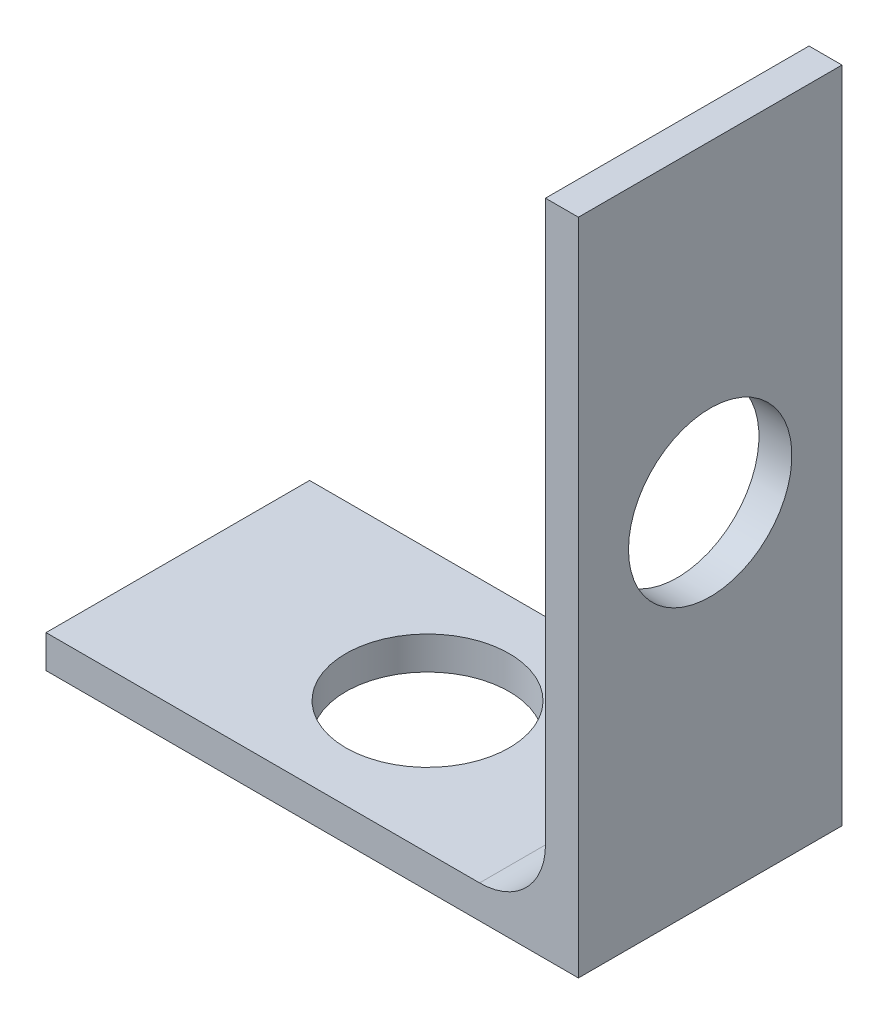
ISO-10303-21;
HEADER;
FILE_DESCRIPTION(('STEP AP214'),'2;1');
FILE_NAME('part.step','',(''),(''),'','','');
FILE_SCHEMA(('AUTOMOTIVE_DESIGN { 1 0 10303 214 1 1 1 1 }'));
ENDSEC;
DATA;
#1=APPLICATION_CONTEXT('core data for automotive mechanical design processes');
#2=APPLICATION_PROTOCOL_DEFINITION('international standard','automotive_design',2000,#1);
#3=PRODUCT_CONTEXT('',#1,'mechanical');
#4=PRODUCT('Part','Part','',(#3));
#5=PRODUCT_RELATED_PRODUCT_CATEGORY('part','',(#4));
#6=PRODUCT_DEFINITION_FORMATION('','',#4);
#7=PRODUCT_DEFINITION_CONTEXT('part definition',#1,'design');
#8=PRODUCT_DEFINITION('design','',#6,#7);
#9=PRODUCT_DEFINITION_SHAPE('','',#8);
#10=(LENGTH_UNIT() NAMED_UNIT(*) SI_UNIT(.MILLI.,.METRE.));
#11=(NAMED_UNIT(*) PLANE_ANGLE_UNIT() SI_UNIT($,.RADIAN.));
#12=(NAMED_UNIT(*) SI_UNIT($,.STERADIAN.) SOLID_ANGLE_UNIT());
#13=UNCERTAINTY_MEASURE_WITH_UNIT(LENGTH_MEASURE(1.E-05),#10,'distance_accuracy_value','');
#14=(GEOMETRIC_REPRESENTATION_CONTEXT(3) GLOBAL_UNCERTAINTY_ASSIGNED_CONTEXT((#13)) GLOBAL_UNIT_ASSIGNED_CONTEXT((#10,
#11,#12)) REPRESENTATION_CONTEXT('',''));
#15=CARTESIAN_POINT('',(0.,0.,0.));
#16=DIRECTION('',(0.,0.,1.));
#17=DIRECTION('',(1.,0.,0.));
#18=AXIS2_PLACEMENT_3D('',#15,#16,#17);
#19=CARTESIAN_POINT('',(20.8915,4.7625,12.7));
#20=DIRECTION('',(0.,0.,-1.));
#21=DIRECTION('',(-1.,0.,0.));
#22=AXIS2_PLACEMENT_3D('',#19,#20,#21);
#23=CYLINDRICAL_SURFACE('',#22,3.175);
#24=DIRECTION('',(0.,0.,1.));
#25=VECTOR('',#24,1.);
#26=CARTESIAN_POINT('',(24.0665,4.7625,12.7));
#27=LINE('',#26,#25);
#28=CARTESIAN_POINT('',(24.0665,4.7625,0.));
#29=VERTEX_POINT('',#28);
#30=CARTESIAN_POINT('',(24.0665,4.7625,12.7));
#31=VERTEX_POINT('',#30);
#32=EDGE_CURVE('E130',#29,#31,#27,.T.);
#33=ORIENTED_EDGE('',*,*,#32,.F.);
#34=CARTESIAN_POINT('',(20.8915,4.7625,0.));
#35=DIRECTION('',(0.,0.,-1.));
#36=DIRECTION('',(-1.,0.,0.));
#37=AXIS2_PLACEMENT_3D('',#34,#35,#36);
#38=CIRCLE('',#37,3.175);
#39=CARTESIAN_POINT('',(20.8915,1.5875,0.));
#40=VERTEX_POINT('',#39);
#41=EDGE_CURVE('E55',#29,#40,#38,.T.);
#42=ORIENTED_EDGE('',*,*,#41,.T.);
#43=DIRECTION('',(0.,0.,1.));
#44=VECTOR('',#43,1.);
#45=CARTESIAN_POINT('',(20.8915,1.5875,12.7));
#46=LINE('',#45,#44);
#47=CARTESIAN_POINT('',(20.8915,1.5875,12.7));
#48=VERTEX_POINT('',#47);
#49=EDGE_CURVE('E136',#48,#40,#46,.F.);
#50=ORIENTED_EDGE('',*,*,#49,.F.);
#51=CARTESIAN_POINT('',(20.8915,4.7625,12.7));
#52=DIRECTION('',(0.,0.,-1.));
#53=DIRECTION('',(-1.,0.,0.));
#54=AXIS2_PLACEMENT_3D('',#51,#52,#53);
#55=CIRCLE('',#54,3.175);
#56=EDGE_CURVE('E11',#48,#31,#55,.F.);
#57=ORIENTED_EDGE('',*,*,#56,.T.);
#58=EDGE_LOOP('',(#33,#42,#50,#57));
#59=FACE_BOUND('',#58,.T.);
#60=ADVANCED_FACE('F47',(#59),#23,.F.);
#61=CARTESIAN_POINT('',(0.,0.,12.7));
#62=DIRECTION('',(1.,0.,0.));
#63=DIRECTION('',(0.,0.,-1.));
#64=AXIS2_PLACEMENT_3D('',#61,#62,#63);
#65=PLANE('',#64);
#66=DIRECTION('',(0.,-1.,0.));
#67=VECTOR('',#66,1.);
#68=CARTESIAN_POINT('',(0.,0.,0.));
#69=LINE('',#68,#67);
#70=CARTESIAN_POINT('',(0.,1.5875,0.));
#71=VERTEX_POINT('',#70);
#72=CARTESIAN_POINT('',(0.,0.,0.));
#73=VERTEX_POINT('',#72);
#74=EDGE_CURVE('E128',#71,#73,#69,.T.);
#75=ORIENTED_EDGE('',*,*,#74,.T.);
#76=DIRECTION('',(0.,0.,-1.));
#77=VECTOR('',#76,1.);
#78=CARTESIAN_POINT('',(0.,0.,12.7));
#79=LINE('',#78,#77);
#80=CARTESIAN_POINT('',(0.,0.,12.7));
#81=VERTEX_POINT('',#80);
#82=EDGE_CURVE('E107',#81,#73,#79,.T.);
#83=ORIENTED_EDGE('',*,*,#82,.F.);
#84=DIRECTION('',(0.,-1.,0.));
#85=VECTOR('',#84,1.);
#86=CARTESIAN_POINT('',(0.,0.,12.7));
#87=LINE('',#86,#85);
#88=CARTESIAN_POINT('',(0.,1.5875,12.7));
#89=VERTEX_POINT('',#88);
#90=EDGE_CURVE('E114',#89,#81,#87,.T.);
#91=ORIENTED_EDGE('',*,*,#90,.F.);
#92=DIRECTION('',(0.,0.,-1.));
#93=VECTOR('',#92,1.);
#94=CARTESIAN_POINT('',(0.,1.5875,12.7));
#95=LINE('',#94,#93);
#96=EDGE_CURVE('E164',#89,#71,#95,.T.);
#97=ORIENTED_EDGE('',*,*,#96,.T.);
#98=EDGE_LOOP('',(#75,#83,#91,#97));
#99=FACE_BOUND('',#98,.T.);
#100=ADVANCED_FACE('F126',(#99),#65,.F.);
#101=CARTESIAN_POINT('',(0.,0.,12.7));
#102=DIRECTION('',(0.,1.,0.));
#103=DIRECTION('',(0.,0.,1.));
#104=AXIS2_PLACEMENT_3D('',#101,#102,#103);
#105=PLANE('',#104);
#106=CARTESIAN_POINT('',(12.03325,0.,6.35));
#107=DIRECTION('',(0.,1.,0.));
#108=DIRECTION('',(0.,0.,1.));
#109=AXIS2_PLACEMENT_3D('',#106,#107,#108);
#110=CIRCLE('',#109,3.937);
#111=CARTESIAN_POINT('',(12.03325,0.,10.287));
#112=VERTEX_POINT('',#111);
#113=EDGE_CURVE('E232',#112,#112,#110,.T.);
#114=ORIENTED_EDGE('',*,*,#113,.T.);
#115=EDGE_LOOP('',(#114));
#116=FACE_BOUND('',#115,.T.);
#117=DIRECTION('',(1.,0.,0.));
#118=VECTOR('',#117,1.);
#119=CARTESIAN_POINT('',(0.,0.,0.));
#120=LINE('',#119,#118);
#121=CARTESIAN_POINT('',(25.654,0.,0.));
#122=VERTEX_POINT('',#121);
#123=EDGE_CURVE('E211',#73,#122,#120,.T.);
#124=ORIENTED_EDGE('',*,*,#123,.T.);
#125=DIRECTION('',(0.,0.,-1.));
#126=VECTOR('',#125,1.);
#127=CARTESIAN_POINT('',(25.654,0.,12.7));
#128=LINE('',#127,#126);
#129=CARTESIAN_POINT('',(25.654,0.,12.7));
#130=VERTEX_POINT('',#129);
#131=EDGE_CURVE('E110',#130,#122,#128,.T.);
#132=ORIENTED_EDGE('',*,*,#131,.F.);
#133=DIRECTION('',(1.,0.,0.));
#134=VECTOR('',#133,1.);
#135=CARTESIAN_POINT('',(0.,0.,12.7));
#136=LINE('',#135,#134);
#137=EDGE_CURVE('E103',#81,#130,#136,.T.);
#138=ORIENTED_EDGE('',*,*,#137,.F.);
#139=ORIENTED_EDGE('',*,*,#82,.T.);
#140=EDGE_LOOP('',(#124,#132,#138,#139));
#141=FACE_BOUND('',#140,.T.);
#142=ADVANCED_FACE('F105',(#116,#141),#105,.F.);
#143=CARTESIAN_POINT('',(25.654,0.,12.7));
#144=DIRECTION('',(-1.,0.,0.));
#145=DIRECTION('',(0.,0.,1.));
#146=AXIS2_PLACEMENT_3D('',#143,#144,#145);
#147=PLANE('',#146);
#148=CARTESIAN_POINT('',(25.654,16.66875,6.35));
#149=DIRECTION('',(-1.,0.,0.));
#150=DIRECTION('',(0.,0.,1.));
#151=AXIS2_PLACEMENT_3D('',#148,#149,#150);
#152=CIRCLE('',#151,3.937);
#153=CARTESIAN_POINT('',(25.654,16.66875,10.287));
#154=VERTEX_POINT('',#153);
#155=EDGE_CURVE('E220',#154,#154,#152,.T.);
#156=ORIENTED_EDGE('',*,*,#155,.T.);
#157=EDGE_LOOP('',(#156));
#158=FACE_BOUND('',#157,.T.);
#159=DIRECTION('',(0.,1.,0.));
#160=VECTOR('',#159,1.);
#161=CARTESIAN_POINT('',(25.654,0.,0.));
#162=LINE('',#161,#160);
#163=CARTESIAN_POINT('',(25.654,31.75,0.));
#164=VERTEX_POINT('',#163);
#165=EDGE_CURVE('E206',#122,#164,#162,.T.);
#166=ORIENTED_EDGE('',*,*,#165,.T.);
#167=DIRECTION('',(0.,0.,-1.));
#168=VECTOR('',#167,1.);
#169=CARTESIAN_POINT('',(25.654,31.75,12.7));
#170=LINE('',#169,#168);
#171=CARTESIAN_POINT('',(25.654,31.75,12.7));
#172=VERTEX_POINT('',#171);
#173=EDGE_CURVE('E138',#172,#164,#170,.T.);
#174=ORIENTED_EDGE('',*,*,#173,.F.);
#175=DIRECTION('',(0.,1.,0.));
#176=VECTOR('',#175,1.);
#177=CARTESIAN_POINT('',(25.654,0.,12.7));
#178=LINE('',#177,#176);
#179=EDGE_CURVE('E113',#130,#172,#178,.T.);
#180=ORIENTED_EDGE('',*,*,#179,.F.);
#181=ORIENTED_EDGE('',*,*,#131,.T.);
#182=EDGE_LOOP('',(#166,#174,#180,#181));
#183=FACE_BOUND('',#182,.T.);
#184=ADVANCED_FACE('F260',(#158,#183),#147,.F.);
#185=CARTESIAN_POINT('',(24.0665,31.75,12.7));
#186=DIRECTION('',(0.,-1.,0.));
#187=DIRECTION('',(0.,0.,-1.));
#188=AXIS2_PLACEMENT_3D('',#185,#186,#187);
#189=PLANE('',#188);
#190=DIRECTION('',(-1.,0.,0.));
#191=VECTOR('',#190,1.);
#192=CARTESIAN_POINT('',(24.0665,31.75,0.));
#193=LINE('',#192,#191);
#194=CARTESIAN_POINT('',(24.0665,31.75,0.));
#195=VERTEX_POINT('',#194);
#196=EDGE_CURVE('E201',#164,#195,#193,.T.);
#197=ORIENTED_EDGE('',*,*,#196,.T.);
#198=DIRECTION('',(0.,0.,-1.));
#199=VECTOR('',#198,1.);
#200=CARTESIAN_POINT('',(24.0665,31.75,12.7));
#201=LINE('',#200,#199);
#202=CARTESIAN_POINT('',(24.0665,31.75,12.7));
#203=VERTEX_POINT('',#202);
#204=EDGE_CURVE('E159',#203,#195,#201,.T.);
#205=ORIENTED_EDGE('',*,*,#204,.F.);
#206=DIRECTION('',(-1.,0.,0.));
#207=VECTOR('',#206,1.);
#208=CARTESIAN_POINT('',(24.0665,31.75,12.7));
#209=LINE('',#208,#207);
#210=EDGE_CURVE('E178',#172,#203,#209,.T.);
#211=ORIENTED_EDGE('',*,*,#210,.F.);
#212=ORIENTED_EDGE('',*,*,#173,.T.);
#213=EDGE_LOOP('',(#197,#205,#211,#212));
#214=FACE_BOUND('',#213,.T.);
#215=ADVANCED_FACE('F266',(#214),#189,.F.);
#216=CARTESIAN_POINT('',(24.0665,1.5875,12.7));
#217=DIRECTION('',(1.,0.,0.));
#218=DIRECTION('',(0.,0.,-1.));
#219=AXIS2_PLACEMENT_3D('',#216,#217,#218);
#220=PLANE('',#219);
#221=CARTESIAN_POINT('',(24.0665,16.66875,6.35));
#222=DIRECTION('',(-1.,0.,0.));
#223=DIRECTION('',(0.,0.,1.));
#224=AXIS2_PLACEMENT_3D('',#221,#222,#223);
#225=CIRCLE('',#224,3.937);
#226=CARTESIAN_POINT('',(24.0665,16.66875,10.287));
#227=VERTEX_POINT('',#226);
#228=EDGE_CURVE('E226',#227,#227,#225,.T.);
#229=ORIENTED_EDGE('',*,*,#228,.F.);
#230=EDGE_LOOP('',(#229));
#231=FACE_BOUND('',#230,.T.);
#232=DIRECTION('',(0.,-1.,0.));
#233=VECTOR('',#232,1.);
#234=CARTESIAN_POINT('',(24.0665,1.5875,0.));
#235=LINE('',#234,#233);
#236=EDGE_CURVE('E195',#195,#29,#235,.T.);
#237=ORIENTED_EDGE('',*,*,#236,.T.);
#238=ORIENTED_EDGE('',*,*,#32,.T.);
#239=DIRECTION('',(0.,-1.,0.));
#240=VECTOR('',#239,1.);
#241=CARTESIAN_POINT('',(24.0665,1.5875,12.7));
#242=LINE('',#241,#240);
#243=EDGE_CURVE('E173',#203,#31,#242,.T.);
#244=ORIENTED_EDGE('',*,*,#243,.F.);
#245=ORIENTED_EDGE('',*,*,#204,.T.);
#246=EDGE_LOOP('',(#237,#238,#244,#245));
#247=FACE_BOUND('',#246,.T.);
#248=ADVANCED_FACE('F252',(#231,#247),#220,.F.);
#249=CARTESIAN_POINT('',(0.,1.5875,12.7));
#250=DIRECTION('',(0.,-1.,0.));
#251=DIRECTION('',(0.,0.,-1.));
#252=AXIS2_PLACEMENT_3D('',#249,#250,#251);
#253=PLANE('',#252);
#254=CARTESIAN_POINT('',(12.03325,1.5875,6.35));
#255=DIRECTION('',(0.,1.,0.));
#256=DIRECTION('',(0.,0.,1.));
#257=AXIS2_PLACEMENT_3D('',#254,#255,#256);
#258=CIRCLE('',#257,3.937);
#259=CARTESIAN_POINT('',(12.03325,1.5875,10.287));
#260=VERTEX_POINT('',#259);
#261=EDGE_CURVE('E238',#260,#260,#258,.T.);
#262=ORIENTED_EDGE('',*,*,#261,.F.);
#263=EDGE_LOOP('',(#262));
#264=FACE_BOUND('',#263,.T.);
#265=DIRECTION('',(-1.,0.,0.));
#266=VECTOR('',#265,1.);
#267=CARTESIAN_POINT('',(0.,1.5875,12.7));
#268=LINE('',#267,#266);
#269=EDGE_CURVE('E119',#48,#89,#268,.T.);
#270=ORIENTED_EDGE('',*,*,#269,.F.);
#271=ORIENTED_EDGE('',*,*,#49,.T.);
#272=DIRECTION('',(-1.,0.,0.));
#273=VECTOR('',#272,1.);
#274=CARTESIAN_POINT('',(0.,1.5875,0.));
#275=LINE('',#274,#273);
#276=EDGE_CURVE('E124',#40,#71,#275,.T.);
#277=ORIENTED_EDGE('',*,*,#276,.T.);
#278=ORIENTED_EDGE('',*,*,#96,.F.);
#279=EDGE_LOOP('',(#270,#271,#277,#278));
#280=FACE_BOUND('',#279,.T.);
#281=ADVANCED_FACE('F249',(#264,#280),#253,.F.);
#282=CARTESIAN_POINT('',(0.,0.,12.7));
#283=DIRECTION('',(0.,0.,-1.));
#284=DIRECTION('',(-1.,0.,0.));
#285=AXIS2_PLACEMENT_3D('',#282,#283,#284);
#286=PLANE('',#285);
#287=ORIENTED_EDGE('',*,*,#56,.F.);
#288=ORIENTED_EDGE('',*,*,#269,.T.);
#289=ORIENTED_EDGE('',*,*,#90,.T.);
#290=ORIENTED_EDGE('',*,*,#137,.T.);
#291=ORIENTED_EDGE('',*,*,#179,.T.);
#292=ORIENTED_EDGE('',*,*,#210,.T.);
#293=ORIENTED_EDGE('',*,*,#243,.T.);
#294=EDGE_LOOP('',(#287,#288,#289,#290,#291,#292,#293));
#295=FACE_BOUND('',#294,.T.);
#296=ADVANCED_FACE('F117',(#295),#286,.F.);
#297=CARTESIAN_POINT('',(0.,0.,0.));
#298=DIRECTION('',(0.,0.,-1.));
#299=DIRECTION('',(-1.,0.,0.));
#300=AXIS2_PLACEMENT_3D('',#297,#298,#299);
#301=PLANE('',#300);
#302=ORIENTED_EDGE('',*,*,#74,.F.);
#303=ORIENTED_EDGE('',*,*,#276,.F.);
#304=ORIENTED_EDGE('',*,*,#41,.F.);
#305=ORIENTED_EDGE('',*,*,#236,.F.);
#306=ORIENTED_EDGE('',*,*,#196,.F.);
#307=ORIENTED_EDGE('',*,*,#165,.F.);
#308=ORIENTED_EDGE('',*,*,#123,.F.);
#309=EDGE_LOOP('',(#302,#303,#304,#305,#306,#307,#308));
#310=FACE_BOUND('',#309,.T.);
#311=ADVANCED_FACE('F256',(#310),#301,.T.);
#312=CARTESIAN_POINT('',(30.4165,16.66875,6.35));
#313=DIRECTION('',(-1.,0.,0.));
#314=DIRECTION('',(0.,0.,1.));
#315=AXIS2_PLACEMENT_3D('',#312,#313,#314);
#316=CYLINDRICAL_SURFACE('',#315,3.937);
#317=ORIENTED_EDGE('',*,*,#228,.T.);
#318=EDGE_LOOP('',(#317));
#319=FACE_BOUND('',#318,.T.);
#320=ORIENTED_EDGE('',*,*,#155,.F.);
#321=EDGE_LOOP('',(#320));
#322=FACE_BOUND('',#321,.T.);
#323=ADVANCED_FACE('F290',(#319,#322),#316,.F.);
#324=CARTESIAN_POINT('',(12.03325,-4.7625,6.35));
#325=DIRECTION('',(0.,1.,0.));
#326=DIRECTION('',(0.,0.,1.));
#327=AXIS2_PLACEMENT_3D('',#324,#325,#326);
#328=CYLINDRICAL_SURFACE('',#327,3.937);
#329=ORIENTED_EDGE('',*,*,#261,.T.);
#330=EDGE_LOOP('',(#329));
#331=FACE_BOUND('',#330,.T.);
#332=ORIENTED_EDGE('',*,*,#113,.F.);
#333=EDGE_LOOP('',(#332));
#334=FACE_BOUND('',#333,.T.);
#335=ADVANCED_FACE('F246',(#331,#334),#328,.F.);
#336=CLOSED_SHELL('',(#60,#100,#142,#184,#215,#248,#281,#296,#311,#323,#335));
#337=MANIFOLD_SOLID_BREP('B2',#336);
#338=ADVANCED_BREP_SHAPE_REPRESENTATION('',(#18,#337),#14);
#339=SHAPE_DEFINITION_REPRESENTATION(#9,#338);
ENDSEC;
END-ISO-10303-21;
